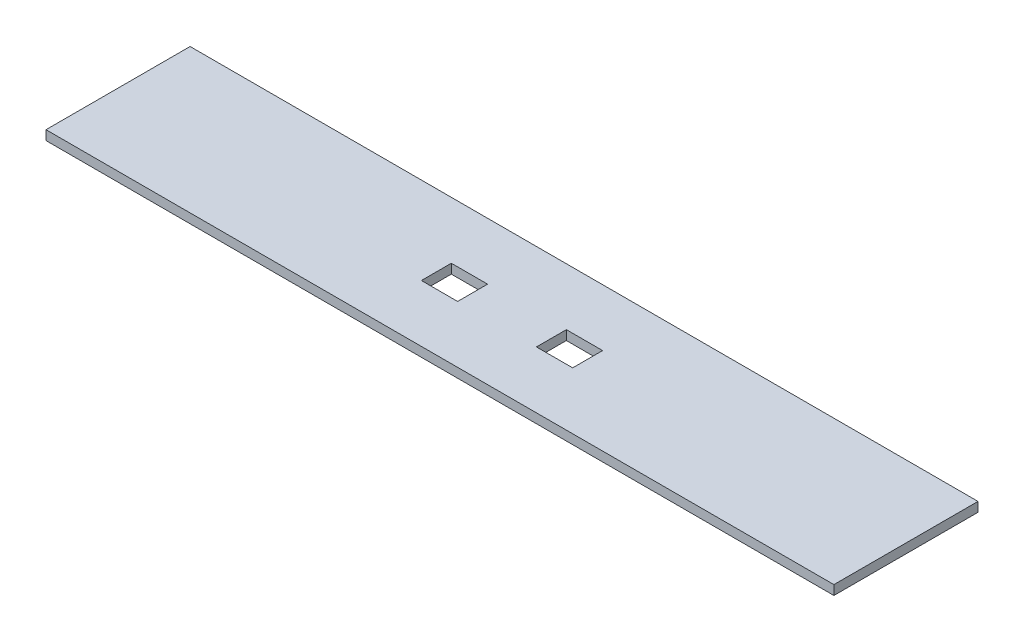
ISO-10303-21;
HEADER;
FILE_DESCRIPTION(('STEP AP214'),'2;1');
FILE_NAME('part.step','',(''),(''),'','','');
FILE_SCHEMA(('AUTOMOTIVE_DESIGN { 1 0 10303 214 1 1 1 1 }'));
ENDSEC;
DATA;
#1=APPLICATION_CONTEXT('core data for automotive mechanical design processes');
#2=APPLICATION_PROTOCOL_DEFINITION('international standard','automotive_design',2000,#1);
#3=PRODUCT_CONTEXT('',#1,'mechanical');
#4=PRODUCT('Part','Part','',(#3));
#5=PRODUCT_RELATED_PRODUCT_CATEGORY('part','',(#4));
#6=PRODUCT_DEFINITION_FORMATION('','',#4);
#7=PRODUCT_DEFINITION_CONTEXT('part definition',#1,'design');
#8=PRODUCT_DEFINITION('design','',#6,#7);
#9=PRODUCT_DEFINITION_SHAPE('','',#8);
#10=(LENGTH_UNIT() NAMED_UNIT(*) SI_UNIT(.MILLI.,.METRE.));
#11=(NAMED_UNIT(*) PLANE_ANGLE_UNIT() SI_UNIT($,.RADIAN.));
#12=(NAMED_UNIT(*) SI_UNIT($,.STERADIAN.) SOLID_ANGLE_UNIT());
#13=UNCERTAINTY_MEASURE_WITH_UNIT(LENGTH_MEASURE(1.E-05),#10,'distance_accuracy_value','');
#14=(GEOMETRIC_REPRESENTATION_CONTEXT(3) GLOBAL_UNCERTAINTY_ASSIGNED_CONTEXT((#13)) GLOBAL_UNIT_ASSIGNED_CONTEXT((#10,
#11,#12)) REPRESENTATION_CONTEXT('',''));
#15=CARTESIAN_POINT('',(0.,0.,0.));
#16=DIRECTION('',(0.,0.,1.));
#17=DIRECTION('',(1.,0.,0.));
#18=AXIS2_PLACEMENT_3D('',#15,#16,#17);
#19=CARTESIAN_POINT('',(125.,3.,-22.86));
#20=DIRECTION('',(-1.,0.,0.));
#21=DIRECTION('',(0.,0.,1.));
#22=AXIS2_PLACEMENT_3D('',#19,#20,#21);
#23=PLANE('',#22);
#24=DIRECTION('',(0.,0.,-1.));
#25=VECTOR('',#24,1.);
#26=CARTESIAN_POINT('',(125.,0.,-22.86));
#27=LINE('',#26,#25);
#28=CARTESIAN_POINT('',(125.,0.,22.86));
#29=VERTEX_POINT('',#28);
#30=CARTESIAN_POINT('',(125.,0.,-22.86));
#31=VERTEX_POINT('',#30);
#32=EDGE_CURVE('E170',#29,#31,#27,.T.);
#33=ORIENTED_EDGE('',*,*,#32,.T.);
#34=DIRECTION('',(0.,-1.,0.));
#35=VECTOR('',#34,1.);
#36=CARTESIAN_POINT('',(125.,3.,-22.86));
#37=LINE('',#36,#35);
#38=CARTESIAN_POINT('',(125.,3.,-22.86));
#39=VERTEX_POINT('',#38);
#40=EDGE_CURVE('E238',#39,#31,#37,.T.);
#41=ORIENTED_EDGE('',*,*,#40,.F.);
#42=DIRECTION('',(0.,0.,-1.));
#43=VECTOR('',#42,1.);
#44=CARTESIAN_POINT('',(125.,3.,-22.86));
#45=LINE('',#44,#43);
#46=CARTESIAN_POINT('',(125.,3.,22.86));
#47=VERTEX_POINT('',#46);
#48=EDGE_CURVE('E201',#47,#39,#45,.T.);
#49=ORIENTED_EDGE('',*,*,#48,.F.);
#50=DIRECTION('',(0.,-1.,0.));
#51=VECTOR('',#50,1.);
#52=CARTESIAN_POINT('',(125.,3.,22.86));
#53=LINE('',#52,#51);
#54=EDGE_CURVE('E215',#47,#29,#53,.T.);
#55=ORIENTED_EDGE('',*,*,#54,.T.);
#56=EDGE_LOOP('',(#33,#41,#49,#55));
#57=FACE_BOUND('',#56,.T.);
#58=ADVANCED_FACE('F45',(#57),#23,.F.);
#59=CARTESIAN_POINT('',(-125.,3.,-22.86));
#60=DIRECTION('',(0.,0.,1.));
#61=DIRECTION('',(1.,0.,0.));
#62=AXIS2_PLACEMENT_3D('',#59,#60,#61);
#63=PLANE('',#62);
#64=DIRECTION('',(-1.,0.,0.));
#65=VECTOR('',#64,1.);
#66=CARTESIAN_POINT('',(-125.,0.,-22.86));
#67=LINE('',#66,#65);
#68=CARTESIAN_POINT('',(-125.,0.,-22.86));
#69=VERTEX_POINT('',#68);
#70=EDGE_CURVE('E219',#31,#69,#67,.T.);
#71=ORIENTED_EDGE('',*,*,#70,.T.);
#72=DIRECTION('',(0.,-1.,0.));
#73=VECTOR('',#72,1.);
#74=CARTESIAN_POINT('',(-125.,3.,-22.86));
#75=LINE('',#74,#73);
#76=CARTESIAN_POINT('',(-125.,3.,-22.86));
#77=VERTEX_POINT('',#76);
#78=EDGE_CURVE('E234',#77,#69,#75,.T.);
#79=ORIENTED_EDGE('',*,*,#78,.F.);
#80=DIRECTION('',(-1.,0.,0.));
#81=VECTOR('',#80,1.);
#82=CARTESIAN_POINT('',(-125.,3.,-22.86));
#83=LINE('',#82,#81);
#84=EDGE_CURVE('E205',#39,#77,#83,.T.);
#85=ORIENTED_EDGE('',*,*,#84,.F.);
#86=ORIENTED_EDGE('',*,*,#40,.T.);
#87=EDGE_LOOP('',(#71,#79,#85,#86));
#88=FACE_BOUND('',#87,.T.);
#89=ADVANCED_FACE('F285',(#88),#63,.F.);
#90=CARTESIAN_POINT('',(-125.,3.,-22.86));
#91=DIRECTION('',(1.,0.,0.));
#92=DIRECTION('',(0.,0.,-1.));
#93=AXIS2_PLACEMENT_3D('',#90,#91,#92);
#94=PLANE('',#93);
#95=DIRECTION('',(0.,0.,1.));
#96=VECTOR('',#95,1.);
#97=CARTESIAN_POINT('',(-125.,0.,-22.86));
#98=LINE('',#97,#96);
#99=CARTESIAN_POINT('',(-125.,0.,22.86));
#100=VERTEX_POINT('',#99);
#101=EDGE_CURVE('E222',#69,#100,#98,.T.);
#102=ORIENTED_EDGE('',*,*,#101,.T.);
#103=DIRECTION('',(0.,-1.,0.));
#104=VECTOR('',#103,1.);
#105=CARTESIAN_POINT('',(-125.,3.,22.86));
#106=LINE('',#105,#104);
#107=CARTESIAN_POINT('',(-125.,3.,22.86));
#108=VERTEX_POINT('',#107);
#109=EDGE_CURVE('E230',#108,#100,#106,.T.);
#110=ORIENTED_EDGE('',*,*,#109,.F.);
#111=DIRECTION('',(0.,0.,1.));
#112=VECTOR('',#111,1.);
#113=CARTESIAN_POINT('',(-125.,3.,-22.86));
#114=LINE('',#113,#112);
#115=EDGE_CURVE('E209',#77,#108,#114,.T.);
#116=ORIENTED_EDGE('',*,*,#115,.F.);
#117=ORIENTED_EDGE('',*,*,#78,.T.);
#118=EDGE_LOOP('',(#102,#110,#116,#117));
#119=FACE_BOUND('',#118,.T.);
#120=ADVANCED_FACE('F290',(#119),#94,.F.);
#121=CARTESIAN_POINT('',(-125.,3.,22.86));
#122=DIRECTION('',(0.,0.,-1.));
#123=DIRECTION('',(-1.,0.,0.));
#124=AXIS2_PLACEMENT_3D('',#121,#122,#123);
#125=PLANE('',#124);
#126=DIRECTION('',(1.,0.,0.));
#127=VECTOR('',#126,1.);
#128=CARTESIAN_POINT('',(-125.,0.,22.86));
#129=LINE('',#128,#127);
#130=EDGE_CURVE('E206',#100,#29,#129,.T.);
#131=ORIENTED_EDGE('',*,*,#130,.T.);
#132=ORIENTED_EDGE('',*,*,#54,.F.);
#133=DIRECTION('',(1.,0.,0.));
#134=VECTOR('',#133,1.);
#135=CARTESIAN_POINT('',(-125.,3.,22.86));
#136=LINE('',#135,#134);
#137=EDGE_CURVE('E212',#108,#47,#136,.T.);
#138=ORIENTED_EDGE('',*,*,#137,.F.);
#139=ORIENTED_EDGE('',*,*,#109,.T.);
#140=EDGE_LOOP('',(#131,#132,#138,#139));
#141=FACE_BOUND('',#140,.T.);
#142=ADVANCED_FACE('F305',(#141),#125,.F.);
#143=CARTESIAN_POINT('',(0.,3.,0.));
#144=DIRECTION('',(0.,1.,0.));
#145=DIRECTION('',(0.,0.,1.));
#146=AXIS2_PLACEMENT_3D('',#143,#144,#145);
#147=PLANE('',#146);
#148=DIRECTION('',(0.,0.,-1.));
#149=VECTOR('',#148,1.);
#150=CARTESIAN_POINT('',(-12.5,3.,-4.750000001));
#151=LINE('',#150,#149);
#152=CARTESIAN_POINT('',(-12.5,3.,4.750000001));
#153=VERTEX_POINT('',#152);
#154=CARTESIAN_POINT('',(-12.5,3.,-4.750000001));
#155=VERTEX_POINT('',#154);
#156=EDGE_CURVE('E60',#153,#155,#151,.T.);
#157=ORIENTED_EDGE('',*,*,#156,.F.);
#158=DIRECTION('',(1.,0.,0.));
#159=VECTOR('',#158,1.);
#160=CARTESIAN_POINT('',(-24.000000066,3.,4.750000001));
#161=LINE('',#160,#159);
#162=CARTESIAN_POINT('',(-24.000000066,3.,4.750000001));
#163=VERTEX_POINT('',#162);
#164=EDGE_CURVE('E160',#163,#153,#161,.T.);
#165=ORIENTED_EDGE('',*,*,#164,.F.);
#166=DIRECTION('',(0.,0.,1.));
#167=VECTOR('',#166,1.);
#168=CARTESIAN_POINT('',(-24.000000066,3.,-4.750000001));
#169=LINE('',#168,#167);
#170=CARTESIAN_POINT('',(-24.000000066,3.,-4.750000001));
#171=VERTEX_POINT('',#170);
#172=EDGE_CURVE('E141',#171,#163,#169,.T.);
#173=ORIENTED_EDGE('',*,*,#172,.F.);
#174=DIRECTION('',(-1.,0.,0.));
#175=VECTOR('',#174,1.);
#176=CARTESIAN_POINT('',(-24.000000066,3.,-4.750000001));
#177=LINE('',#176,#175);
#178=EDGE_CURVE('E152',#155,#171,#177,.T.);
#179=ORIENTED_EDGE('',*,*,#178,.F.);
#180=EDGE_LOOP('',(#157,#165,#173,#179));
#181=FACE_BOUND('',#180,.T.);
#182=DIRECTION('',(0.,0.,-1.));
#183=VECTOR('',#182,1.);
#184=CARTESIAN_POINT('',(24.000000066,3.,4.750000025));
#185=LINE('',#184,#183);
#186=CARTESIAN_POINT('',(24.000000066,3.,4.750000025));
#187=VERTEX_POINT('',#186);
#188=CARTESIAN_POINT('',(24.000000066,3.,-4.750000025));
#189=VERTEX_POINT('',#188);
#190=EDGE_CURVE('E68',#187,#189,#185,.T.);
#191=ORIENTED_EDGE('',*,*,#190,.F.);
#192=DIRECTION('',(1.,0.,0.));
#193=VECTOR('',#192,1.);
#194=CARTESIAN_POINT('',(12.5,3.,4.750000025));
#195=LINE('',#194,#193);
#196=CARTESIAN_POINT('',(12.5,3.,4.750000025));
#197=VERTEX_POINT('',#196);
#198=EDGE_CURVE('E178',#197,#187,#195,.T.);
#199=ORIENTED_EDGE('',*,*,#198,.F.);
#200=DIRECTION('',(0.,0.,1.));
#201=VECTOR('',#200,1.);
#202=CARTESIAN_POINT('',(12.5,3.,4.750000025));
#203=LINE('',#202,#201);
#204=CARTESIAN_POINT('',(12.5,3.,-4.750000025));
#205=VERTEX_POINT('',#204);
#206=EDGE_CURVE('E191',#205,#197,#203,.T.);
#207=ORIENTED_EDGE('',*,*,#206,.F.);
#208=DIRECTION('',(-1.,0.,0.));
#209=VECTOR('',#208,1.);
#210=CARTESIAN_POINT('',(12.5,3.,-4.750000025));
#211=LINE('',#210,#209);
#212=EDGE_CURVE('E195',#189,#205,#211,.T.);
#213=ORIENTED_EDGE('',*,*,#212,.F.);
#214=EDGE_LOOP('',(#191,#199,#207,#213));
#215=FACE_BOUND('',#214,.T.);
#216=ORIENTED_EDGE('',*,*,#48,.T.);
#217=ORIENTED_EDGE('',*,*,#84,.T.);
#218=ORIENTED_EDGE('',*,*,#115,.T.);
#219=ORIENTED_EDGE('',*,*,#137,.T.);
#220=EDGE_LOOP('',(#216,#217,#218,#219));
#221=FACE_BOUND('',#220,.T.);
#222=ADVANCED_FACE('F157',(#181,#215,#221),#147,.T.);
#223=CARTESIAN_POINT('',(0.,0.,0.));
#224=DIRECTION('',(0.,1.,0.));
#225=DIRECTION('',(0.,0.,1.));
#226=AXIS2_PLACEMENT_3D('',#223,#224,#225);
#227=PLANE('',#226);
#228=DIRECTION('',(1.,0.,0.));
#229=VECTOR('',#228,1.);
#230=CARTESIAN_POINT('',(0.,0.,4.750000001));
#231=LINE('',#230,#229);
#232=CARTESIAN_POINT('',(-24.000000066,0.,4.750000001));
#233=VERTEX_POINT('',#232);
#234=CARTESIAN_POINT('',(-12.5,0.,4.750000001));
#235=VERTEX_POINT('',#234);
#236=EDGE_CURVE('E53',#233,#235,#231,.T.);
#237=ORIENTED_EDGE('',*,*,#236,.T.);
#238=DIRECTION('',(0.,0.,-1.));
#239=VECTOR('',#238,1.);
#240=CARTESIAN_POINT('',(-12.5,0.,0.));
#241=LINE('',#240,#239);
#242=CARTESIAN_POINT('',(-12.5,0.,-4.750000001));
#243=VERTEX_POINT('',#242);
#244=EDGE_CURVE('E11',#235,#243,#241,.T.);
#245=ORIENTED_EDGE('',*,*,#244,.T.);
#246=DIRECTION('',(-1.,0.,0.));
#247=VECTOR('',#246,1.);
#248=CARTESIAN_POINT('',(0.,0.,-4.750000001));
#249=LINE('',#248,#247);
#250=CARTESIAN_POINT('',(-24.000000066,0.,-4.750000001));
#251=VERTEX_POINT('',#250);
#252=EDGE_CURVE('E258',#243,#251,#249,.T.);
#253=ORIENTED_EDGE('',*,*,#252,.T.);
#254=DIRECTION('',(0.,0.,1.));
#255=VECTOR('',#254,1.);
#256=CARTESIAN_POINT('',(-24.000000066,0.,0.));
#257=LINE('',#256,#255);
#258=EDGE_CURVE('E144',#251,#233,#257,.T.);
#259=ORIENTED_EDGE('',*,*,#258,.T.);
#260=EDGE_LOOP('',(#237,#245,#253,#259));
#261=FACE_BOUND('',#260,.T.);
#262=DIRECTION('',(1.,0.,0.));
#263=VECTOR('',#262,1.);
#264=CARTESIAN_POINT('',(0.,0.,4.750000025));
#265=LINE('',#264,#263);
#266=CARTESIAN_POINT('',(12.5,0.,4.750000025));
#267=VERTEX_POINT('',#266);
#268=CARTESIAN_POINT('',(24.000000066,0.,4.750000025));
#269=VERTEX_POINT('',#268);
#270=EDGE_CURVE('E250',#267,#269,#265,.T.);
#271=ORIENTED_EDGE('',*,*,#270,.T.);
#272=DIRECTION('',(0.,0.,-1.));
#273=VECTOR('',#272,1.);
#274=CARTESIAN_POINT('',(24.000000066,0.,0.));
#275=LINE('',#274,#273);
#276=CARTESIAN_POINT('',(24.000000066,0.,-4.750000025));
#277=VERTEX_POINT('',#276);
#278=EDGE_CURVE('E254',#269,#277,#275,.T.);
#279=ORIENTED_EDGE('',*,*,#278,.T.);
#280=DIRECTION('',(-1.,0.,0.));
#281=VECTOR('',#280,1.);
#282=CARTESIAN_POINT('',(0.,0.,-4.750000025));
#283=LINE('',#282,#281);
#284=CARTESIAN_POINT('',(12.5,0.,-4.750000025));
#285=VERTEX_POINT('',#284);
#286=EDGE_CURVE('E242',#277,#285,#283,.T.);
#287=ORIENTED_EDGE('',*,*,#286,.T.);
#288=DIRECTION('',(0.,0.,1.));
#289=VECTOR('',#288,1.);
#290=CARTESIAN_POINT('',(12.5,0.,0.));
#291=LINE('',#290,#289);
#292=EDGE_CURVE('E246',#285,#267,#291,.T.);
#293=ORIENTED_EDGE('',*,*,#292,.T.);
#294=EDGE_LOOP('',(#271,#279,#287,#293));
#295=FACE_BOUND('',#294,.T.);
#296=ORIENTED_EDGE('',*,*,#32,.F.);
#297=ORIENTED_EDGE('',*,*,#130,.F.);
#298=ORIENTED_EDGE('',*,*,#101,.F.);
#299=ORIENTED_EDGE('',*,*,#70,.F.);
#300=EDGE_LOOP('',(#296,#297,#298,#299));
#301=FACE_BOUND('',#300,.T.);
#302=ADVANCED_FACE('F265',(#261,#295,#301),#227,.F.);
#303=CARTESIAN_POINT('',(24.000000066,-1.2E-05,4.750000025));
#304=DIRECTION('',(1.,0.,0.));
#305=DIRECTION('',(0.,0.,-1.));
#306=AXIS2_PLACEMENT_3D('',#303,#304,#305);
#307=PLANE('',#306);
#308=DIRECTION('',(0.,1.,0.));
#309=VECTOR('',#308,1.);
#310=CARTESIAN_POINT('',(24.000000066,-1.2E-05,4.750000025));
#311=LINE('',#310,#309);
#312=EDGE_CURVE('E185',#269,#187,#311,.T.);
#313=ORIENTED_EDGE('',*,*,#312,.T.);
#314=ORIENTED_EDGE('',*,*,#190,.T.);
#315=DIRECTION('',(0.,1.,0.));
#316=VECTOR('',#315,1.);
#317=CARTESIAN_POINT('',(24.000000066,-1.2E-05,-4.750000025));
#318=LINE('',#317,#316);
#319=EDGE_CURVE('E175',#277,#189,#318,.T.);
#320=ORIENTED_EDGE('',*,*,#319,.F.);
#321=ORIENTED_EDGE('',*,*,#278,.F.);
#322=EDGE_LOOP('',(#313,#314,#320,#321));
#323=FACE_BOUND('',#322,.T.);
#324=ADVANCED_FACE('F316',(#323),#307,.F.);
#325=CARTESIAN_POINT('',(12.5,-1.2E-05,4.750000025));
#326=DIRECTION('',(0.,0.,1.));
#327=DIRECTION('',(1.,0.,0.));
#328=AXIS2_PLACEMENT_3D('',#325,#326,#327);
#329=PLANE('',#328);
#330=DIRECTION('',(0.,1.,0.));
#331=VECTOR('',#330,1.);
#332=CARTESIAN_POINT('',(12.5,-1.2E-05,4.750000025));
#333=LINE('',#332,#331);
#334=EDGE_CURVE('E182',#267,#197,#333,.T.);
#335=ORIENTED_EDGE('',*,*,#334,.T.);
#336=ORIENTED_EDGE('',*,*,#198,.T.);
#337=ORIENTED_EDGE('',*,*,#312,.F.);
#338=ORIENTED_EDGE('',*,*,#270,.F.);
#339=EDGE_LOOP('',(#335,#336,#337,#338));
#340=FACE_BOUND('',#339,.T.);
#341=ADVANCED_FACE('F319',(#340),#329,.F.);
#342=CARTESIAN_POINT('',(12.5,-1.2E-05,4.750000025));
#343=DIRECTION('',(-1.,0.,0.));
#344=DIRECTION('',(0.,0.,1.));
#345=AXIS2_PLACEMENT_3D('',#342,#343,#344);
#346=PLANE('',#345);
#347=DIRECTION('',(0.,1.,0.));
#348=VECTOR('',#347,1.);
#349=CARTESIAN_POINT('',(12.5,-1.2E-05,-4.750000025));
#350=LINE('',#349,#348);
#351=EDGE_CURVE('E179',#285,#205,#350,.T.);
#352=ORIENTED_EDGE('',*,*,#351,.T.);
#353=ORIENTED_EDGE('',*,*,#206,.T.);
#354=ORIENTED_EDGE('',*,*,#334,.F.);
#355=ORIENTED_EDGE('',*,*,#292,.F.);
#356=EDGE_LOOP('',(#352,#353,#354,#355));
#357=FACE_BOUND('',#356,.T.);
#358=ADVANCED_FACE('F279',(#357),#346,.F.);
#359=CARTESIAN_POINT('',(12.5,-1.2E-05,-4.750000025));
#360=DIRECTION('',(0.,0.,-1.));
#361=DIRECTION('',(-1.,0.,0.));
#362=AXIS2_PLACEMENT_3D('',#359,#360,#361);
#363=PLANE('',#362);
#364=ORIENTED_EDGE('',*,*,#319,.T.);
#365=ORIENTED_EDGE('',*,*,#212,.T.);
#366=ORIENTED_EDGE('',*,*,#351,.F.);
#367=ORIENTED_EDGE('',*,*,#286,.F.);
#368=EDGE_LOOP('',(#364,#365,#366,#367));
#369=FACE_BOUND('',#368,.T.);
#370=ADVANCED_FACE('F272',(#369),#363,.F.);
#371=CARTESIAN_POINT('',(-12.5,-1.2E-05,-4.750000001));
#372=DIRECTION('',(1.,0.,0.));
#373=DIRECTION('',(0.,0.,-1.));
#374=AXIS2_PLACEMENT_3D('',#371,#372,#373);
#375=PLANE('',#374);
#376=DIRECTION('',(0.,1.,0.));
#377=VECTOR('',#376,1.);
#378=CARTESIAN_POINT('',(-12.5,-1.2E-05,4.750000001));
#379=LINE('',#378,#377);
#380=EDGE_CURVE('E167',#235,#153,#379,.T.);
#381=ORIENTED_EDGE('',*,*,#380,.T.);
#382=ORIENTED_EDGE('',*,*,#156,.T.);
#383=DIRECTION('',(0.,1.,0.));
#384=VECTOR('',#383,1.);
#385=CARTESIAN_POINT('',(-12.5,-1.2E-05,-4.750000001));
#386=LINE('',#385,#384);
#387=EDGE_CURVE('E149',#243,#155,#386,.T.);
#388=ORIENTED_EDGE('',*,*,#387,.F.);
#389=ORIENTED_EDGE('',*,*,#244,.F.);
#390=EDGE_LOOP('',(#381,#382,#388,#389));
#391=FACE_BOUND('',#390,.T.);
#392=ADVANCED_FACE('F270',(#391),#375,.F.);
#393=CARTESIAN_POINT('',(-24.000000066,-1.2E-05,4.750000001));
#394=DIRECTION('',(0.,0.,1.));
#395=DIRECTION('',(1.,0.,0.));
#396=AXIS2_PLACEMENT_3D('',#393,#394,#395);
#397=PLANE('',#396);
#398=DIRECTION('',(0.,1.,0.));
#399=VECTOR('',#398,1.);
#400=CARTESIAN_POINT('',(-24.000000066,-1.2E-05,4.750000001));
#401=LINE('',#400,#399);
#402=EDGE_CURVE('E148',#233,#163,#401,.T.);
#403=ORIENTED_EDGE('',*,*,#402,.T.);
#404=ORIENTED_EDGE('',*,*,#164,.T.);
#405=ORIENTED_EDGE('',*,*,#380,.F.);
#406=ORIENTED_EDGE('',*,*,#236,.F.);
#407=EDGE_LOOP('',(#403,#404,#405,#406));
#408=FACE_BOUND('',#407,.T.);
#409=ADVANCED_FACE('F269',(#408),#397,.F.);
#410=CARTESIAN_POINT('',(-24.000000066,-1.2E-05,-4.750000001));
#411=DIRECTION('',(-1.,0.,0.));
#412=DIRECTION('',(0.,0.,1.));
#413=AXIS2_PLACEMENT_3D('',#410,#411,#412);
#414=PLANE('',#413);
#415=DIRECTION('',(0.,1.,0.));
#416=VECTOR('',#415,1.);
#417=CARTESIAN_POINT('',(-24.000000066,-1.2E-05,-4.750000001));
#418=LINE('',#417,#416);
#419=EDGE_CURVE('E136',#251,#171,#418,.T.);
#420=ORIENTED_EDGE('',*,*,#419,.T.);
#421=ORIENTED_EDGE('',*,*,#172,.T.);
#422=ORIENTED_EDGE('',*,*,#402,.F.);
#423=ORIENTED_EDGE('',*,*,#258,.F.);
#424=EDGE_LOOP('',(#420,#421,#422,#423));
#425=FACE_BOUND('',#424,.T.);
#426=ADVANCED_FACE('F138',(#425),#414,.F.);
#427=CARTESIAN_POINT('',(-24.000000066,-1.2E-05,-4.750000001));
#428=DIRECTION('',(0.,0.,-1.));
#429=DIRECTION('',(-1.,0.,0.));
#430=AXIS2_PLACEMENT_3D('',#427,#428,#429);
#431=PLANE('',#430);
#432=ORIENTED_EDGE('',*,*,#387,.T.);
#433=ORIENTED_EDGE('',*,*,#178,.T.);
#434=ORIENTED_EDGE('',*,*,#419,.F.);
#435=ORIENTED_EDGE('',*,*,#252,.F.);
#436=EDGE_LOOP('',(#432,#433,#434,#435));
#437=FACE_BOUND('',#436,.T.);
#438=ADVANCED_FACE('F153',(#437),#431,.F.);
#439=CLOSED_SHELL('',(#58,#89,#120,#142,#222,#302,#324,#341,#358,#370,#392,#409,#426,#438));
#440=MANIFOLD_SOLID_BREP('B2',#439);
#441=ADVANCED_BREP_SHAPE_REPRESENTATION('',(#18,#440),#14);
#442=SHAPE_DEFINITION_REPRESENTATION(#9,#441);
ENDSEC;
END-ISO-10303-21;
